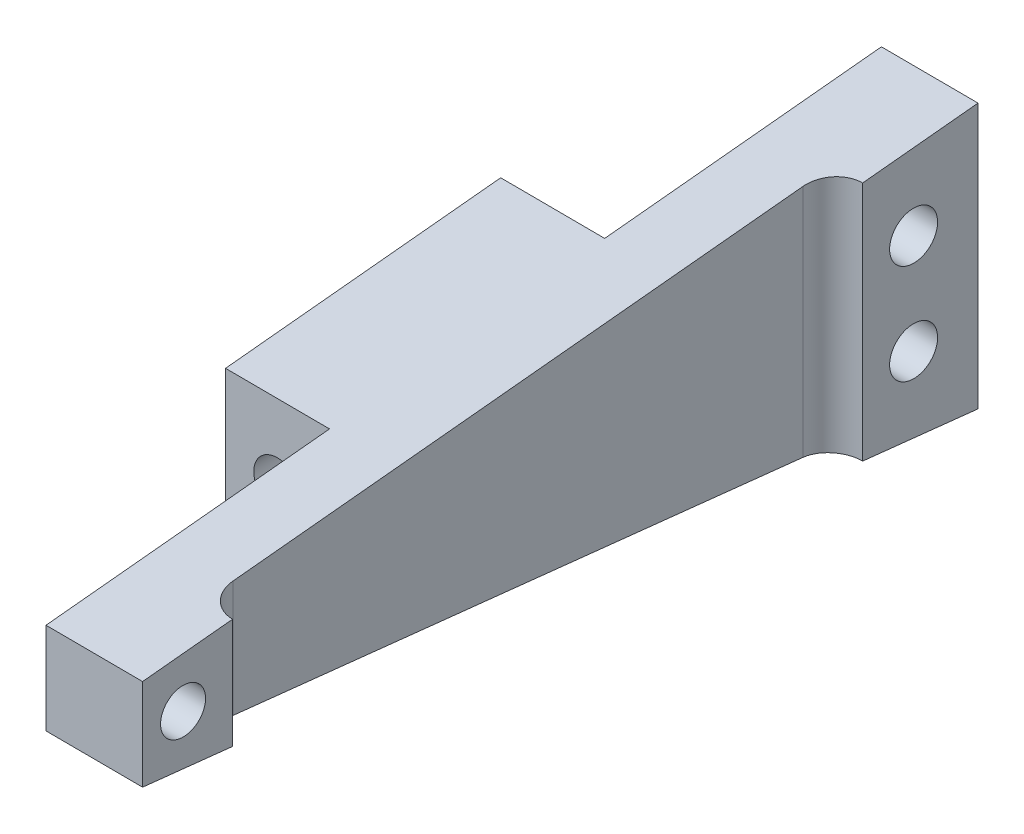
ISO-10303-21;
HEADER;
FILE_DESCRIPTION(('STEP AP214'),'2;1');
FILE_NAME('part.step','',(''),(''),'','','');
FILE_SCHEMA(('AUTOMOTIVE_DESIGN { 1 0 10303 214 1 1 1 1 }'));
ENDSEC;
DATA;
#1=APPLICATION_CONTEXT('core data for automotive mechanical design processes');
#2=APPLICATION_PROTOCOL_DEFINITION('international standard','automotive_design',2000,#1);
#3=PRODUCT_CONTEXT('',#1,'mechanical');
#4=PRODUCT('Part','Part','',(#3));
#5=PRODUCT_RELATED_PRODUCT_CATEGORY('part','',(#4));
#6=PRODUCT_DEFINITION_FORMATION('','',#4);
#7=PRODUCT_DEFINITION_CONTEXT('part definition',#1,'design');
#8=PRODUCT_DEFINITION('design','',#6,#7);
#9=PRODUCT_DEFINITION_SHAPE('','',#8);
#10=(LENGTH_UNIT() NAMED_UNIT(*) SI_UNIT(.MILLI.,.METRE.));
#11=(NAMED_UNIT(*) PLANE_ANGLE_UNIT() SI_UNIT($,.RADIAN.));
#12=(NAMED_UNIT(*) SI_UNIT($,.STERADIAN.) SOLID_ANGLE_UNIT());
#13=UNCERTAINTY_MEASURE_WITH_UNIT(LENGTH_MEASURE(1.E-05),#10,'distance_accuracy_value','');
#14=(GEOMETRIC_REPRESENTATION_CONTEXT(3) GLOBAL_UNCERTAINTY_ASSIGNED_CONTEXT((#13)) GLOBAL_UNIT_ASSIGNED_CONTEXT((#10,
#11,#12)) REPRESENTATION_CONTEXT('',''));
#15=CARTESIAN_POINT('',(0.,0.,0.));
#16=DIRECTION('',(0.,0.,1.));
#17=DIRECTION('',(1.,0.,0.));
#18=AXIS2_PLACEMENT_3D('',#15,#16,#17);
#19=CARTESIAN_POINT('',(130.825950697131,1.57325215210244,266.501896775733));
#20=DIRECTION('',(-0.999988650443594,0.,-0.00476434507561088));
#21=DIRECTION('',(0.,1.,0.));
#22=AXIS2_PLACEMENT_3D('',#19,#20,#21);
#23=PLANE('',#22);
#24=CARTESIAN_POINT('',(130.824521389846,1.56936987160643,266.801894160618));
#25=DIRECTION('',(0.999988650443594,0.,0.0047643450756115));
#26=DIRECTION('',(0.,-1.,0.));
#27=AXIS2_PLACEMENT_3D('',#24,#25,#26);
#28=CIRCLE('',#27,1.50000002235174);
#29=CARTESIAN_POINT('',(130.824521389846,3.06936989395742,266.801894160618));
#30=VERTEX_POINT('',#29);
#31=EDGE_CURVE('E27',#30,#30,#28,.T.);
#32=ORIENTED_EDGE('',*,*,#31,.F.);
#33=EDGE_LOOP('',(#32));
#34=FACE_BOUND('',#33,.T.);
#35=DIRECTION('',(0.00473836325241601,0.104293034034695,-0.994535324141645));
#36=VECTOR('',#35,1.);
#37=CARTESIAN_POINT('',(130.811657661905,4.63450482074439,269.501862727063));
#38=LINE('',#37,#36);
#39=CARTESIAN_POINT('',(130.811657661905,4.63450482074439,269.501862727063));
#40=VERTEX_POINT('',#39);
#41=CARTESIAN_POINT('',(130.840243732358,5.26369423909948,263.501930824402));
#42=VERTEX_POINT('',#41);
#43=EDGE_CURVE('E187',#40,#42,#38,.T.);
#44=ORIENTED_EDGE('',*,*,#43,.F.);
#45=DIRECTION('',(0.,-1.,0.));
#46=VECTOR('',#45,1.);
#47=CARTESIAN_POINT('',(130.811657661905,4.63450482074439,269.501862727063));
#48=LINE('',#47,#46);
#49=CARTESIAN_POINT('',(130.811657661905,-1.4957650775326,269.501862727063));
#50=VERTEX_POINT('',#49);
#51=EDGE_CURVE('E11',#40,#50,#48,.T.);
#52=ORIENTED_EDGE('',*,*,#51,.T.);
#53=DIRECTION('',(-0.00473899547985651,0.103019741551577,0.994668022393647));
#54=VECTOR('',#53,1.);
#55=CARTESIAN_POINT('',(131.076998466519,-7.26393709428799,213.809466625877));
#56=LINE('',#55,#54);
#57=CARTESIAN_POINT('',(130.840243732358,-2.11718993489554,263.501930824402));
#58=VERTEX_POINT('',#57);
#59=EDGE_CURVE('E216',#58,#50,#56,.T.);
#60=ORIENTED_EDGE('',*,*,#59,.F.);
#61=DIRECTION('',(0.,-1.,0.));
#62=VECTOR('',#61,1.);
#63=CARTESIAN_POINT('',(130.840243732358,5.26369423909948,263.501930824402));
#64=LINE('',#63,#62);
#65=EDGE_CURVE('E156',#42,#58,#64,.T.);
#66=ORIENTED_EDGE('',*,*,#65,.F.);
#67=EDGE_LOOP('',(#44,#52,#60,#66));
#68=FACE_BOUND('',#67,.T.);
#69=ADVANCED_FACE('F16',(#34,#68),#23,.F.);
#70=CARTESIAN_POINT('',(130.811657661905,-1.4957650775326,269.501862727063));
#71=DIRECTION('',(-0.004764345075611,0.,0.999988650443594));
#72=DIRECTION('',(0.,1.,0.));
#73=AXIS2_PLACEMENT_3D('',#70,#71,#72);
#74=PLANE('',#73);
#75=DIRECTION('',(-0.999988650443594,0.,-0.004764345075611));
#76=VECTOR('',#75,1.);
#77=CARTESIAN_POINT('',(130.811657661905,-1.4957650775326,269.501862727063));
#78=LINE('',#77,#76);
#79=CARTESIAN_POINT('',(124.311731434021,-1.49576507753264,269.470894484072));
#80=VERTEX_POINT('',#79);
#81=EDGE_CURVE('E220',#50,#80,#78,.T.);
#82=ORIENTED_EDGE('',*,*,#81,.F.);
#83=ORIENTED_EDGE('',*,*,#51,.F.);
#84=DIRECTION('',(-0.999988650443594,0.,-0.004764345075611));
#85=VECTOR('',#84,1.);
#86=CARTESIAN_POINT('',(127.311697385352,4.63450482074436,269.485187519299));
#87=LINE('',#86,#85);
#88=CARTESIAN_POINT('',(124.311731434021,4.63450482074435,269.470894484072));
#89=VERTEX_POINT('',#88);
#90=EDGE_CURVE('E186',#40,#89,#87,.T.);
#91=ORIENTED_EDGE('',*,*,#90,.T.);
#92=DIRECTION('',(0.,1.,0.));
#93=VECTOR('',#92,1.);
#94=CARTESIAN_POINT('',(124.311731434021,0.0548203934633562,269.470894484072));
#95=LINE('',#94,#93);
#96=EDGE_CURVE('E261',#80,#89,#95,.T.);
#97=ORIENTED_EDGE('',*,*,#96,.F.);
#98=EDGE_LOOP('',(#82,#83,#91,#97));
#99=FACE_BOUND('',#98,.T.);
#100=ADVANCED_FACE('F385',(#99),#74,.T.);
#101=CARTESIAN_POINT('',(130.824521389846,1.56936987160643,266.801894160618));
#102=DIRECTION('',(-0.999988650443594,0.,-0.004764345075611));
#103=DIRECTION('',(0.,-1.,0.));
#104=AXIS2_PLACEMENT_3D('',#101,#102,#103);
#105=CYLINDRICAL_SURFACE('',#104,1.50000002235174);
#106=CARTESIAN_POINT('',(124.324595161963,1.56936987160639,266.770925917626));
#107=DIRECTION('',(0.999988650443594,0.,0.00476434507561118));
#108=DIRECTION('',(0.,-1.,0.));
#109=AXIS2_PLACEMENT_3D('',#106,#107,#108);
#110=CIRCLE('',#109,1.50000002235174);
#111=CARTESIAN_POINT('',(124.324595161963,3.06936989395738,266.770925917626));
#112=VERTEX_POINT('',#111);
#113=EDGE_CURVE('E197',#112,#112,#110,.T.);
#114=ORIENTED_EDGE('',*,*,#113,.F.);
#115=DIRECTION('',(0.999988650443594,0.,0.004764345075611));
#116=VECTOR('',#115,1.);
#117=CARTESIAN_POINT('',(130.824521389846,3.06936989395742,266.801894160618));
#118=LINE('',#117,#116);
#119=EDGE_CURVE('E205',#112,#30,#118,.T.);
#120=ORIENTED_EDGE('',*,*,#119,.T.);
#121=ORIENTED_EDGE('',*,*,#31,.T.);
#122=ORIENTED_EDGE('',*,*,#119,.F.);
#123=EDGE_LOOP('',(#114,#120,#121,#122));
#124=FACE_BOUND('',#123,.T.);
#125=ADVANCED_FACE('F391',(#124),#105,.F.);
#126=CARTESIAN_POINT('',(131.058679028346,1.60540586445897,217.654534513304));
#127=DIRECTION('',(-0.999988650443594,0.,-0.00476434507561118));
#128=DIRECTION('',(0.00476434507561118,0.,-0.999988650443594));
#129=AXIS2_PLACEMENT_3D('',#126,#127,#128);
#130=PLANE('',#129);
#131=CARTESIAN_POINT('',(131.056544998353,-1.78063012839304,218.102446186298));
#132=DIRECTION('',(-0.999988650443594,0.,-0.00476434507561118));
#133=DIRECTION('',(0.,-1.,0.));
#134=AXIS2_PLACEMENT_3D('',#131,#132,#133);
#135=CIRCLE('',#134,1.6);
#136=CARTESIAN_POINT('',(131.056544998353,-0.180630128393033,218.102446186298));
#137=VERTEX_POINT('',#136);
#138=EDGE_CURVE('E254',#137,#137,#135,.T.);
#139=ORIENTED_EDGE('',*,*,#138,.T.);
#140=EDGE_LOOP('',(#139));
#141=FACE_BOUND('',#140,.T.);
#142=CARTESIAN_POINT('',(131.056544998353,4.91936987160697,218.102446186298));
#143=DIRECTION('',(-0.999988650443594,0.,-0.00476434507561118));
#144=DIRECTION('',(0.,-1.,0.));
#145=AXIS2_PLACEMENT_3D('',#142,#143,#144);
#146=CIRCLE('',#145,1.6);
#147=CARTESIAN_POINT('',(131.056544998353,6.51936987160696,218.102446186298));
#148=VERTEX_POINT('',#147);
#149=EDGE_CURVE('E269',#148,#148,#146,.T.);
#150=ORIENTED_EDGE('',*,*,#149,.T.);
#151=EDGE_LOOP('',(#150));
#152=FACE_BOUND('',#151,.T.);
#153=DIRECTION('',(0.,-1.,0.));
#154=VECTOR('',#153,1.);
#155=CARTESIAN_POINT('',(131.076998466519,10.474748823207,213.809466625877));
#156=LINE('',#155,#154);
#157=CARTESIAN_POINT('',(131.076998466519,10.474748823207,213.809466625877));
#158=VERTEX_POINT('',#157);
#159=CARTESIAN_POINT('',(131.076998466519,-7.26393709428799,213.809466625877));
#160=VERTEX_POINT('',#159);
#161=EDGE_CURVE('E137',#158,#160,#156,.T.);
#162=ORIENTED_EDGE('',*,*,#161,.F.);
#163=DIRECTION('',(0.00473836325241601,0.104293034034695,-0.994535324141645));
#164=VECTOR('',#163,1.);
#165=CARTESIAN_POINT('',(130.811657661905,4.63450482074439,269.501862727063));
#166=LINE('',#165,#164);
#167=CARTESIAN_POINT('',(131.040359590174,9.66831432799092,221.499602400732));
#168=VERTEX_POINT('',#167);
#169=EDGE_CURVE('E159',#168,#158,#166,.T.);
#170=ORIENTED_EDGE('',*,*,#169,.F.);
#171=DIRECTION('',(0.,-1.,0.));
#172=VECTOR('',#171,1.);
#173=CARTESIAN_POINT('',(131.040359590174,9.66831432799092,221.499602400732));
#174=LINE('',#173,#172);
#175=CARTESIAN_POINT('',(131.040359590174,-6.46745446673207,221.499602400732));
#176=VERTEX_POINT('',#175);
#177=EDGE_CURVE('E147',#168,#176,#174,.T.);
#178=ORIENTED_EDGE('',*,*,#177,.T.);
#179=DIRECTION('',(-0.00473899547985651,0.103019741551577,0.994668022393647));
#180=VECTOR('',#179,1.);
#181=CARTESIAN_POINT('',(131.076998466519,-7.26393709428799,213.809466625877));
#182=LINE('',#181,#180);
#183=EDGE_CURVE('E206',#160,#176,#182,.T.);
#184=ORIENTED_EDGE('',*,*,#183,.F.);
#185=EDGE_LOOP('',(#162,#170,#178,#184));
#186=FACE_BOUND('',#185,.T.);
#187=ADVANCED_FACE('F160',(#141,#152,#186),#130,.F.);
#188=CARTESIAN_POINT('',(130.849772422509,3.43206208486448,261.501953523515));
#189=DIRECTION('',(0.,1.,0.));
#190=DIRECTION('',(-0.710467656549133,0.,0.703729855127366));
#191=AXIS2_PLACEMENT_3D('',#188,#189,#190);
#192=CYLINDRICAL_SURFACE('',#191,2.);
#193=CARTESIAN_POINT('',(130.84977242251,-2.32433155401653,261.501953523515));
#194=DIRECTION('',(-0.000490821598348776,-0.994679311562599,0.103018572323209));
#195=DIRECTION('',(-0.00473899547989709,0.103019741551577,0.994668022393646));
#196=AXIS2_PLACEMENT_3D('',#193,#194,#195);
#197=ELLIPSE('',#196,2.01069829919161,2.);
#198=CARTESIAN_POINT('',(128.849795121622,-2.32433155401654,261.492424833363));
#199=VERTEX_POINT('',#198);
#200=EDGE_CURVE('E221',#58,#199,#197,.T.);
#201=ORIENTED_EDGE('',*,*,#200,.T.);
#202=DIRECTION('',(0.,1.,0.));
#203=VECTOR('',#202,1.);
#204=CARTESIAN_POINT('',(128.849795121622,3.43206208486446,261.492424833363));
#205=LINE('',#204,#203);
#206=CARTESIAN_POINT('',(128.849795121622,5.47342404521847,261.492424833363));
#207=VERTEX_POINT('',#206);
#208=EDGE_CURVE('E192',#199,#207,#205,.T.);
#209=ORIENTED_EDGE('',*,*,#208,.T.);
#210=CARTESIAN_POINT('',(130.849772422509,5.47342404521849,261.501953523515));
#211=DIRECTION('',(-0.000496888003126927,0.994546611804514,0.104291850355022));
#212=DIRECTION('',(-0.00473836325236151,-0.104293034034695,0.994535324141645));
#213=AXIS2_PLACEMENT_3D('',#210,#211,#212);
#214=ELLIPSE('',#213,2.01096658141661,2.);
#215=EDGE_CURVE('E191',#207,#42,#214,.T.);
#216=ORIENTED_EDGE('',*,*,#215,.T.);
#217=ORIENTED_EDGE('',*,*,#65,.T.);
#218=EDGE_LOOP('',(#201,#209,#216,#217));
#219=FACE_BOUND('',#218,.T.);
#220=ADVANCED_FACE('F316',(#219),#192,.F.);
#221=CARTESIAN_POINT('',(131.030830900023,-2.43351226805108,223.499579701619));
#222=DIRECTION('',(0.,-1.,0.));
#223=DIRECTION('',(-0.703729855127379,0.,-0.71046765654912));
#224=AXIS2_PLACEMENT_3D('',#221,#222,#223);
#225=CYLINDRICAL_SURFACE('',#224,2.);
#226=CARTESIAN_POINT('',(131.030830900023,9.4585845218729,223.499579701619));
#227=DIRECTION('',(-0.000496888003126927,0.994546611804514,0.104291850355022));
#228=DIRECTION('',(0.00473836325237559,0.104293034034695,-0.994535324141645));
#229=AXIS2_PLACEMENT_3D('',#226,#227,#228);
#230=ELLIPSE('',#229,2.01096658141661,2.);
#231=CARTESIAN_POINT('',(129.030853599136,9.45858452187288,223.490051011468));
#232=VERTEX_POINT('',#231);
#233=EDGE_CURVE('E151',#168,#232,#230,.T.);
#234=ORIENTED_EDGE('',*,*,#233,.T.);
#235=DIRECTION('',(0.,-1.,0.));
#236=VECTOR('',#235,1.);
#237=CARTESIAN_POINT('',(129.030853599136,-2.43351226805109,223.490051011468));
#238=LINE('',#237,#236);
#239=CARTESIAN_POINT('',(129.030853599136,-6.26031284761111,223.490051011468));
#240=VERTEX_POINT('',#239);
#241=EDGE_CURVE('E252',#232,#240,#238,.T.);
#242=ORIENTED_EDGE('',*,*,#241,.T.);
#243=CARTESIAN_POINT('',(131.030830900023,-6.2603128476111,223.499579701619));
#244=DIRECTION('',(-0.000490821598348776,-0.994679311562599,0.103018572323209));
#245=DIRECTION('',(0.00473899547989557,-0.103019741551577,-0.994668022393646));
#246=AXIS2_PLACEMENT_3D('',#243,#244,#245);
#247=ELLIPSE('',#246,2.01069829919161,2.);
#248=EDGE_CURVE('E153',#240,#176,#247,.T.);
#249=ORIENTED_EDGE('',*,*,#248,.T.);
#250=ORIENTED_EDGE('',*,*,#177,.F.);
#251=EDGE_LOOP('',(#234,#242,#249,#250));
#252=FACE_BOUND('',#251,.T.);
#253=ADVANCED_FACE('F148',(#252),#225,.F.);
#254=CARTESIAN_POINT('',(131.076998466519,10.474748823207,213.809466625877));
#255=DIRECTION('',(0.004764345075611,0.,-0.999988650443594));
#256=DIRECTION('',(0.999988650443594,0.,0.004764345075611));
#257=AXIS2_PLACEMENT_3D('',#254,#255,#256);
#258=PLANE('',#257);
#259=DIRECTION('',(-0.999988650443594,0.,-0.004764345075611));
#260=VECTOR('',#259,1.);
#261=CARTESIAN_POINT('',(127.577038189966,10.474748823207,213.792791418113));
#262=LINE('',#261,#260);
#263=CARTESIAN_POINT('',(124.577072238635,10.474748823207,213.778498382886));
#264=VERTEX_POINT('',#263);
#265=EDGE_CURVE('E164',#158,#264,#262,.T.);
#266=ORIENTED_EDGE('',*,*,#265,.F.);
#267=ORIENTED_EDGE('',*,*,#161,.T.);
#268=DIRECTION('',(-0.999988650443594,0.,-0.004764345075611));
#269=VECTOR('',#268,1.);
#270=CARTESIAN_POINT('',(131.076998466519,-7.26393709428799,213.809466625877));
#271=LINE('',#270,#269);
#272=CARTESIAN_POINT('',(124.577072238635,-7.26393709428803,213.778498382886));
#273=VERTEX_POINT('',#272);
#274=EDGE_CURVE('E209',#160,#273,#271,.T.);
#275=ORIENTED_EDGE('',*,*,#274,.T.);
#276=DIRECTION('',(0.,-1.,0.));
#277=VECTOR('',#276,1.);
#278=CARTESIAN_POINT('',(124.577072238635,6.04007734383297,213.778498382886));
#279=LINE('',#278,#277);
#280=EDGE_CURVE('E179',#264,#273,#279,.T.);
#281=ORIENTED_EDGE('',*,*,#280,.F.);
#282=EDGE_LOOP('',(#266,#267,#275,#281));
#283=FACE_BOUND('',#282,.T.);
#284=ADVANCED_FACE('F397',(#283),#258,.T.);
#285=CARTESIAN_POINT('',(130.840243732358,-2.11718993489554,263.501930824402));
#286=DIRECTION('',(-0.000490821598348776,-0.994679311562599,0.103018572323209));
#287=DIRECTION('',(-0.999988650443594,0.,-0.00476434507563739));
#288=AXIS2_PLACEMENT_3D('',#285,#286,#287);
#289=PLANE('',#288);
#290=DIRECTION('',(-0.00473899547985687,0.103019741551567,0.994668022393648));
#291=VECTOR('',#290,1.);
#292=CARTESIAN_POINT('',(117.57715168553,-7.26393709428808,213.745147967356));
#293=LINE('',#292,#291);
#294=CARTESIAN_POINT('',(117.489262724955,-5.35334274108028,232.192166745309));
#295=VERTEX_POINT('',#294);
#296=CARTESIAN_POINT('',(117.40186575886,-3.45344372286047,250.535920774764));
#297=VERTEX_POINT('',#296);
#298=EDGE_CURVE('E237',#295,#297,#293,.T.);
#299=ORIENTED_EDGE('',*,*,#298,.F.);
#300=DIRECTION('',(-0.999988650443594,0.,-0.004764345075611));
#301=VECTOR('',#300,1.);
#302=CARTESIAN_POINT('',(124.48918327806,-5.35334274108024,232.225517160838));
#303=LINE('',#302,#301);
#304=CARTESIAN_POINT('',(124.48918327806,-5.35334274108024,232.225517160838));
#305=VERTEX_POINT('',#304);
#306=EDGE_CURVE('E260',#305,#295,#303,.T.);
#307=ORIENTED_EDGE('',*,*,#306,.F.);
#308=DIRECTION('',(-0.00473899547985619,0.103019741551577,0.994668022393647));
#309=VECTOR('',#308,1.);
#310=CARTESIAN_POINT('',(124.447467313823,-4.44649067240932,240.981283193282));
#311=LINE('',#310,#309);
#312=EDGE_CURVE('E172',#273,#305,#311,.T.);
#313=ORIENTED_EDGE('',*,*,#312,.F.);
#314=ORIENTED_EDGE('',*,*,#274,.F.);
#315=ORIENTED_EDGE('',*,*,#183,.T.);
#316=ORIENTED_EDGE('',*,*,#248,.F.);
#317=DIRECTION('',(-0.00473899547985651,0.103019741551577,0.994668022393647));
#318=VECTOR('',#317,1.);
#319=CARTESIAN_POINT('',(128.98891487431,-5.3486182467402,232.292572276008));
#320=LINE('',#319,#318);
#321=EDGE_CURVE('E196',#240,#199,#320,.T.);
#322=ORIENTED_EDGE('',*,*,#321,.T.);
#323=ORIENTED_EDGE('',*,*,#200,.F.);
#324=ORIENTED_EDGE('',*,*,#59,.T.);
#325=ORIENTED_EDGE('',*,*,#81,.T.);
#326=DIRECTION('',(-0.00473899547985619,0.103019741551577,0.994668022393647));
#327=VECTOR('',#326,1.);
#328=CARTESIAN_POINT('',(124.447467313823,-4.44649067240932,240.981283193282));
#329=LINE('',#328,#327);
#330=CARTESIAN_POINT('',(124.401786311965,-3.45344372286042,250.569271190293));
#331=VERTEX_POINT('',#330);
#332=EDGE_CURVE('E265',#331,#80,#329,.T.);
#333=ORIENTED_EDGE('',*,*,#332,.F.);
#334=DIRECTION('',(-0.999988650443594,0.,-0.004764345075611));
#335=VECTOR('',#334,1.);
#336=CARTESIAN_POINT('',(127.651749425907,-3.45344372286041,250.584755311789));
#337=LINE('',#336,#335);
#338=EDGE_CURVE('E244',#331,#297,#337,.T.);
#339=ORIENTED_EDGE('',*,*,#338,.T.);
#340=EDGE_LOOP('',(#299,#307,#313,#314,#315,#316,#322,#323,#324,#325,#333,#339));
#341=FACE_BOUND('',#340,.T.);
#342=ADVANCED_FACE('F329',(#341),#289,.T.);
#343=CARTESIAN_POINT('',(130.811657661905,4.63450482074439,269.501862727063));
#344=DIRECTION('',(-0.000496888003126927,0.994546611804514,0.104291850355022));
#345=DIRECTION('',(0.999988650443594,0.,0.004764345075611));
#346=AXIS2_PLACEMENT_3D('',#343,#344,#345);
#347=PLANE('',#346);
#348=DIRECTION('',(0.00473836325241601,0.104293034034695,-0.994535324141645));
#349=VECTOR('',#348,1.);
#350=CARTESIAN_POINT('',(128.888846076203,6.33294922684356,253.296017824713));
#351=LINE('',#350,#349);
#352=EDGE_CURVE('E170',#207,#232,#351,.T.);
#353=ORIENTED_EDGE('',*,*,#352,.T.);
#354=ORIENTED_EDGE('',*,*,#233,.F.);
#355=ORIENTED_EDGE('',*,*,#169,.T.);
#356=ORIENTED_EDGE('',*,*,#265,.T.);
#357=DIRECTION('',(0.00473836325241601,0.104293034034695,-0.994535324141645));
#358=VECTOR('',#357,1.);
#359=CARTESIAN_POINT('',(124.433150229521,7.30697501708763,243.986296806199));
#360=LINE('',#359,#358);
#361=CARTESIAN_POINT('',(124.48918327806,8.54028203198577,232.225517160839));
#362=VERTEX_POINT('',#361);
#363=EDGE_CURVE('E201',#362,#264,#360,.T.);
#364=ORIENTED_EDGE('',*,*,#363,.F.);
#365=DIRECTION('',(-0.999988650443594,0.,-0.004764345075611));
#366=VECTOR('',#365,1.);
#367=CARTESIAN_POINT('',(124.48918327806,8.54028203198577,232.225517160839));
#368=LINE('',#367,#366);
#369=CARTESIAN_POINT('',(117.489262724955,8.54028203198573,232.192166745309));
#370=VERTEX_POINT('',#369);
#371=EDGE_CURVE('E238',#362,#370,#368,.T.);
#372=ORIENTED_EDGE('',*,*,#371,.T.);
#373=DIRECTION('',(0.00473836325241602,0.104293034034684,-0.994535324141646));
#374=VECTOR('',#373,1.);
#375=CARTESIAN_POINT('',(117.311810880916,4.6345048207443,269.437544068543));
#376=LINE('',#375,#374);
#377=CARTESIAN_POINT('',(117.40186575886,6.61664421151052,250.535920774764));
#378=VERTEX_POINT('',#377);
#379=EDGE_CURVE('E235',#378,#370,#376,.T.);
#380=ORIENTED_EDGE('',*,*,#379,.F.);
#381=DIRECTION('',(-0.999988650443594,0.,-0.004764345075611));
#382=VECTOR('',#381,1.);
#383=CARTESIAN_POINT('',(127.651749425907,6.61664421151058,250.584755311789));
#384=LINE('',#383,#382);
#385=CARTESIAN_POINT('',(124.401786311965,6.61664421151056,250.569271190293));
#386=VERTEX_POINT('',#385);
#387=EDGE_CURVE('E299',#386,#378,#384,.T.);
#388=ORIENTED_EDGE('',*,*,#387,.F.);
#389=DIRECTION('',(0.00473836325241601,0.104293034034695,-0.994535324141645));
#390=VECTOR('',#389,1.);
#391=CARTESIAN_POINT('',(124.433150229521,7.30697501708763,243.986296806199));
#392=LINE('',#391,#390);
#393=EDGE_CURVE('E202',#89,#386,#392,.T.);
#394=ORIENTED_EDGE('',*,*,#393,.F.);
#395=ORIENTED_EDGE('',*,*,#90,.F.);
#396=ORIENTED_EDGE('',*,*,#43,.T.);
#397=ORIENTED_EDGE('',*,*,#215,.F.);
#398=EDGE_LOOP('',(#353,#354,#355,#356,#364,#372,#380,#388,#394,#395,#396,#397));
#399=FACE_BOUND('',#398,.T.);
#400=ADVANCED_FACE('F167',(#399),#347,.T.);
#401=CARTESIAN_POINT('',(124.558752800463,1.60540586445893,217.623566270313));
#402=DIRECTION('',(-0.999988650443594,0.,-0.00476434507561118));
#403=DIRECTION('',(0.00476434507561118,0.,-0.999988650443594));
#404=AXIS2_PLACEMENT_3D('',#401,#402,#403);
#405=PLANE('',#404);
#406=CARTESIAN_POINT('',(124.556618770469,-1.78063012839308,218.071477943306));
#407=DIRECTION('',(0.999988650443594,0.,0.00476434507561118));
#408=DIRECTION('',(0.,-1.,0.));
#409=AXIS2_PLACEMENT_3D('',#406,#407,#408);
#410=CIRCLE('',#409,3.);
#411=CARTESIAN_POINT('',(124.556618770469,1.21936987160692,218.071477943306));
#412=VERTEX_POINT('',#411);
#413=EDGE_CURVE('E229',#412,#412,#410,.T.);
#414=ORIENTED_EDGE('',*,*,#413,.T.);
#415=EDGE_LOOP('',(#414));
#416=FACE_BOUND('',#415,.T.);
#417=CARTESIAN_POINT('',(124.556618770469,4.91936987160693,218.071477943306));
#418=DIRECTION('',(0.999988650443594,0.,0.00476434507561118));
#419=DIRECTION('',(0.,-1.,0.));
#420=AXIS2_PLACEMENT_3D('',#417,#418,#419);
#421=CIRCLE('',#420,3.);
#422=CARTESIAN_POINT('',(124.556618770469,7.91936987160692,218.071477943306));
#423=VERTEX_POINT('',#422);
#424=EDGE_CURVE('E285',#423,#423,#421,.T.);
#425=ORIENTED_EDGE('',*,*,#424,.T.);
#426=EDGE_LOOP('',(#425));
#427=FACE_BOUND('',#426,.T.);
#428=DIRECTION('',(0.,1.,0.));
#429=VECTOR('',#428,1.);
#430=CARTESIAN_POINT('',(124.48918327806,5.07284394822277,232.225517160839));
#431=LINE('',#430,#429);
#432=EDGE_CURVE('E225',#305,#362,#431,.T.);
#433=ORIENTED_EDGE('',*,*,#432,.T.);
#434=ORIENTED_EDGE('',*,*,#363,.T.);
#435=ORIENTED_EDGE('',*,*,#280,.T.);
#436=ORIENTED_EDGE('',*,*,#312,.T.);
#437=EDGE_LOOP('',(#433,#434,#435,#436));
#438=FACE_BOUND('',#437,.T.);
#439=ADVANCED_FACE('F401',(#416,#427,#438),#405,.T.);
#440=CARTESIAN_POINT('',(124.558752800463,1.60540586445893,217.623566270313));
#441=DIRECTION('',(-0.999988650443594,0.,-0.00476434507561118));
#442=DIRECTION('',(0.00476434507561118,0.,-0.999988650443594));
#443=AXIS2_PLACEMENT_3D('',#440,#441,#442);
#444=PLANE('',#443);
#445=ORIENTED_EDGE('',*,*,#113,.T.);
#446=EDGE_LOOP('',(#445));
#447=FACE_BOUND('',#446,.T.);
#448=DIRECTION('',(0.,-1.,0.));
#449=VECTOR('',#448,1.);
#450=CARTESIAN_POINT('',(124.401786311965,-0.820448119640438,250.569271190293));
#451=LINE('',#450,#449);
#452=EDGE_CURVE('E295',#386,#331,#451,.T.);
#453=ORIENTED_EDGE('',*,*,#452,.T.);
#454=ORIENTED_EDGE('',*,*,#332,.T.);
#455=ORIENTED_EDGE('',*,*,#96,.T.);
#456=ORIENTED_EDGE('',*,*,#393,.T.);
#457=EDGE_LOOP('',(#453,#454,#455,#456));
#458=FACE_BOUND('',#457,.T.);
#459=ADVANCED_FACE('F404',(#447,#458),#444,.T.);
#460=CARTESIAN_POINT('',(117.440799896832,1.56936987160562,242.36403241048));
#461=DIRECTION('',(-0.999988650443594,0.,-0.00476434507561118));
#462=DIRECTION('',(0.00476434507561118,0.,-0.999988650443594));
#463=AXIS2_PLACEMENT_3D('',#460,#461,#462);
#464=PLANE('',#463);
#465=ORIENTED_EDGE('',*,*,#379,.T.);
#466=DIRECTION('',(0.,-1.,0.));
#467=VECTOR('',#466,1.);
#468=CARTESIAN_POINT('',(117.489262724955,8.54028203198573,232.192166745309));
#469=LINE('',#468,#467);
#470=EDGE_CURVE('E256',#370,#295,#469,.T.);
#471=ORIENTED_EDGE('',*,*,#470,.T.);
#472=ORIENTED_EDGE('',*,*,#298,.T.);
#473=DIRECTION('',(0.,1.,0.));
#474=VECTOR('',#473,1.);
#475=CARTESIAN_POINT('',(117.40186575886,-0.838466116067471,250.535920774764));
#476=LINE('',#475,#474);
#477=EDGE_CURVE('E248',#297,#378,#476,.T.);
#478=ORIENTED_EDGE('',*,*,#477,.T.);
#479=EDGE_LOOP('',(#465,#471,#472,#478));
#480=FACE_BOUND('',#479,.T.);
#481=ADVANCED_FACE('F416',(#480),#464,.T.);
#482=CARTESIAN_POINT('',(124.48918327806,8.54028203198577,232.225517160839));
#483=DIRECTION('',(0.004764345075611,0.,-0.999988650443594));
#484=DIRECTION('',(0.,1.,0.));
#485=AXIS2_PLACEMENT_3D('',#482,#483,#484);
#486=PLANE('',#485);
#487=CARTESIAN_POINT('',(120.989223001508,1.58030615082674,232.208841953074));
#488=DIRECTION('',(-0.00476434507560551,0.,0.999988650443594));
#489=DIRECTION('',(0.999988650443594,0.,0.00476434507560551));
#490=AXIS2_PLACEMENT_3D('',#487,#488,#489);
#491=CIRCLE('',#490,1.6);
#492=CARTESIAN_POINT('',(119.389241160798,1.58030615082674,232.201219000953));
#493=VERTEX_POINT('',#492);
#494=EDGE_CURVE('E213',#493,#493,#491,.T.);
#495=ORIENTED_EDGE('',*,*,#494,.T.);
#496=EDGE_LOOP('',(#495));
#497=FACE_BOUND('',#496,.T.);
#498=ORIENTED_EDGE('',*,*,#432,.F.);
#499=ORIENTED_EDGE('',*,*,#306,.T.);
#500=ORIENTED_EDGE('',*,*,#470,.F.);
#501=ORIENTED_EDGE('',*,*,#371,.F.);
#502=EDGE_LOOP('',(#498,#499,#500,#501));
#503=FACE_BOUND('',#502,.T.);
#504=ADVANCED_FACE('F18',(#497,#503),#486,.T.);
#505=CARTESIAN_POINT('',(120.892297345261,1.58030615082652,252.552573283416));
#506=DIRECTION('',(0.00476434507560551,0.,-0.999988650443594));
#507=DIRECTION('',(0.999988650443594,0.,0.00476434507560551));
#508=AXIS2_PLACEMENT_3D('',#505,#506,#507);
#509=CYLINDRICAL_SURFACE('',#508,1.6);
#510=CARTESIAN_POINT('',(120.901826035412,1.58030615082654,250.552595982529));
#511=DIRECTION('',(-0.00476434507560551,0.,0.999988650443594));
#512=DIRECTION('',(0.999988650443594,0.,0.00476434507560551));
#513=AXIS2_PLACEMENT_3D('',#510,#511,#512);
#514=CIRCLE('',#513,1.6);
#515=CARTESIAN_POINT('',(119.301844194703,1.58030615082654,250.544973030408));
#516=VERTEX_POINT('',#515);
#517=EDGE_CURVE('E214',#516,#516,#514,.T.);
#518=ORIENTED_EDGE('',*,*,#517,.T.);
#519=DIRECTION('',(0.00476434507560551,0.,-0.999988650443594));
#520=VECTOR('',#519,1.);
#521=CARTESIAN_POINT('',(119.292315504551,1.58030615082652,252.544950331295));
#522=LINE('',#521,#520);
#523=EDGE_CURVE('E210',#516,#493,#522,.T.);
#524=ORIENTED_EDGE('',*,*,#523,.T.);
#525=ORIENTED_EDGE('',*,*,#494,.F.);
#526=ORIENTED_EDGE('',*,*,#523,.F.);
#527=EDGE_LOOP('',(#518,#524,#525,#526));
#528=FACE_BOUND('',#527,.T.);
#529=ADVANCED_FACE('F409',(#528),#509,.F.);
#530=CARTESIAN_POINT('',(120.901826035412,1.58030615082654,250.552595982529));
#531=DIRECTION('',(-0.00476434507560565,0.,0.999988650443594));
#532=DIRECTION('',(-0.999988650443594,0.,-0.00476434507560565));
#533=AXIS2_PLACEMENT_3D('',#530,#531,#532);
#534=PLANE('',#533);
#535=ORIENTED_EDGE('',*,*,#517,.F.);
#536=EDGE_LOOP('',(#535));
#537=FACE_BOUND('',#536,.T.);
#538=ORIENTED_EDGE('',*,*,#452,.F.);
#539=ORIENTED_EDGE('',*,*,#387,.T.);
#540=ORIENTED_EDGE('',*,*,#477,.F.);
#541=ORIENTED_EDGE('',*,*,#338,.F.);
#542=EDGE_LOOP('',(#538,#539,#540,#541));
#543=FACE_BOUND('',#542,.T.);
#544=ADVANCED_FACE('F406',(#537,#543),#534,.T.);
#545=CARTESIAN_POINT('',(128.940324360379,1.60042993062968,242.491237922416));
#546=DIRECTION('',(-0.999988650443594,0.,-0.00476434507561134));
#547=DIRECTION('',(0.,-1.,0.));
#548=AXIS2_PLACEMENT_3D('',#545,#546,#547);
#549=PLANE('',#548);
#550=ORIENTED_EDGE('',*,*,#352,.F.);
#551=ORIENTED_EDGE('',*,*,#208,.F.);
#552=ORIENTED_EDGE('',*,*,#321,.F.);
#553=ORIENTED_EDGE('',*,*,#241,.F.);
#554=EDGE_LOOP('',(#550,#551,#552,#553));
#555=FACE_BOUND('',#554,.T.);
#556=ADVANCED_FACE('F408',(#555),#549,.F.);
#557=CARTESIAN_POINT('',(124.556618770469,-1.78063012839308,218.071477943306));
#558=DIRECTION('',(0.999988650443594,0.,0.004764345075611));
#559=DIRECTION('',(0.,-1.,0.));
#560=AXIS2_PLACEMENT_3D('',#557,#558,#559);
#561=CYLINDRICAL_SURFACE('',#560,1.6);
#562=CARTESIAN_POINT('',(126.556596071356,-1.78063012839307,218.081006633457));
#563=DIRECTION('',(-0.999988650443594,0.,-0.00476434507561118));
#564=DIRECTION('',(0.,-1.,0.));
#565=AXIS2_PLACEMENT_3D('',#562,#563,#564);
#566=CIRCLE('',#565,1.6);
#567=CARTESIAN_POINT('',(126.556596071356,-0.180630128393061,218.081006633457));
#568=VERTEX_POINT('',#567);
#569=EDGE_CURVE('E183',#568,#568,#566,.T.);
#570=ORIENTED_EDGE('',*,*,#569,.T.);
#571=DIRECTION('',(0.999988650443594,0.,0.004764345075611));
#572=VECTOR('',#571,1.);
#573=CARTESIAN_POINT('',(124.556618770469,-0.180630128393075,218.071477943306));
#574=LINE('',#573,#572);
#575=EDGE_CURVE('E20',#568,#137,#574,.T.);
#576=ORIENTED_EDGE('',*,*,#575,.T.);
#577=ORIENTED_EDGE('',*,*,#138,.F.);
#578=ORIENTED_EDGE('',*,*,#575,.F.);
#579=EDGE_LOOP('',(#570,#576,#577,#578));
#580=FACE_BOUND('',#579,.T.);
#581=ADVANCED_FACE('F378',(#580),#561,.F.);
#582=CARTESIAN_POINT('',(124.556618770469,4.91936987160693,218.071477943306));
#583=DIRECTION('',(0.999988650443594,0.,0.004764345075611));
#584=DIRECTION('',(0.,-1.,0.));
#585=AXIS2_PLACEMENT_3D('',#582,#583,#584);
#586=CYLINDRICAL_SURFACE('',#585,1.6);
#587=CARTESIAN_POINT('',(126.556596071356,4.91936987160695,218.081006633457));
#588=DIRECTION('',(-0.999988650443594,0.,-0.00476434507561118));
#589=DIRECTION('',(0.,-1.,0.));
#590=AXIS2_PLACEMENT_3D('',#587,#588,#589);
#591=CIRCLE('',#590,1.6);
#592=CARTESIAN_POINT('',(126.556596071356,6.51936987160694,218.081006633457));
#593=VERTEX_POINT('',#592);
#594=EDGE_CURVE('E234',#593,#593,#591,.T.);
#595=ORIENTED_EDGE('',*,*,#594,.T.);
#596=DIRECTION('',(0.999988650443594,0.,0.004764345075611));
#597=VECTOR('',#596,1.);
#598=CARTESIAN_POINT('',(124.556618770469,6.51936987160692,218.071477943306));
#599=LINE('',#598,#597);
#600=EDGE_CURVE('E272',#593,#148,#599,.T.);
#601=ORIENTED_EDGE('',*,*,#600,.T.);
#602=ORIENTED_EDGE('',*,*,#149,.F.);
#603=ORIENTED_EDGE('',*,*,#600,.F.);
#604=EDGE_LOOP('',(#595,#601,#602,#603));
#605=FACE_BOUND('',#604,.T.);
#606=ADVANCED_FACE('F368',(#605),#586,.F.);
#607=CARTESIAN_POINT('',(126.556596071356,-1.78063012839307,218.081006633457));
#608=DIRECTION('',(-0.999988650443594,0.,-0.00476434507561118));
#609=DIRECTION('',(0.00476434507561118,0.,-0.999988650443594));
#610=AXIS2_PLACEMENT_3D('',#607,#608,#609);
#611=PLANE('',#610);
#612=ORIENTED_EDGE('',*,*,#569,.F.);
#613=EDGE_LOOP('',(#612));
#614=FACE_BOUND('',#613,.T.);
#615=CARTESIAN_POINT('',(126.556596071356,-1.78063012839307,218.081006633457));
#616=DIRECTION('',(0.999988650443594,0.,0.00476434507561118));
#617=DIRECTION('',(0.,-1.,0.));
#618=AXIS2_PLACEMENT_3D('',#615,#616,#617);
#619=CIRCLE('',#618,3.);
#620=CARTESIAN_POINT('',(126.556596071356,1.21936987160694,218.081006633457));
#621=VERTEX_POINT('',#620);
#622=EDGE_CURVE('E279',#621,#621,#619,.T.);
#623=ORIENTED_EDGE('',*,*,#622,.F.);
#624=EDGE_LOOP('',(#623));
#625=FACE_BOUND('',#624,.T.);
#626=ADVANCED_FACE('F366',(#614,#625),#611,.T.);
#627=CARTESIAN_POINT('',(124.556618770469,-1.78063012839308,218.071477943306));
#628=DIRECTION('',(0.999988650443594,0.,0.004764345075611));
#629=DIRECTION('',(0.,-1.,0.));
#630=AXIS2_PLACEMENT_3D('',#627,#628,#629);
#631=CYLINDRICAL_SURFACE('',#630,3.);
#632=ORIENTED_EDGE('',*,*,#413,.F.);
#633=DIRECTION('',(0.999988650443594,0.,0.004764345075611));
#634=VECTOR('',#633,1.);
#635=CARTESIAN_POINT('',(124.556618770469,1.21936987160692,218.071477943306));
#636=LINE('',#635,#634);
#637=EDGE_CURVE('E233',#412,#621,#636,.T.);
#638=ORIENTED_EDGE('',*,*,#637,.T.);
#639=ORIENTED_EDGE('',*,*,#622,.T.);
#640=ORIENTED_EDGE('',*,*,#637,.F.);
#641=EDGE_LOOP('',(#632,#638,#639,#640));
#642=FACE_BOUND('',#641,.T.);
#643=ADVANCED_FACE('F364',(#642),#631,.F.);
#644=CARTESIAN_POINT('',(126.556596071356,4.91936987160695,218.081006633457));
#645=DIRECTION('',(-0.999988650443594,0.,-0.00476434507561118));
#646=DIRECTION('',(0.00476434507561118,0.,-0.999988650443594));
#647=AXIS2_PLACEMENT_3D('',#644,#645,#646);
#648=PLANE('',#647);
#649=ORIENTED_EDGE('',*,*,#594,.F.);
#650=EDGE_LOOP('',(#649));
#651=FACE_BOUND('',#650,.T.);
#652=CARTESIAN_POINT('',(126.556596071356,4.91936987160695,218.081006633457));
#653=DIRECTION('',(0.999988650443594,0.,0.00476434507561118));
#654=DIRECTION('',(0.,-1.,0.));
#655=AXIS2_PLACEMENT_3D('',#652,#653,#654);
#656=CIRCLE('',#655,3.);
#657=CARTESIAN_POINT('',(126.556596071356,7.91936987160693,218.081006633457));
#658=VERTEX_POINT('',#657);
#659=EDGE_CURVE('E284',#658,#658,#656,.T.);
#660=ORIENTED_EDGE('',*,*,#659,.F.);
#661=EDGE_LOOP('',(#660));
#662=FACE_BOUND('',#661,.T.);
#663=ADVANCED_FACE('F376',(#651,#662),#648,.T.);
#664=CARTESIAN_POINT('',(124.556618770469,4.91936987160693,218.071477943306));
#665=DIRECTION('',(0.999988650443594,0.,0.004764345075611));
#666=DIRECTION('',(0.,-1.,0.));
#667=AXIS2_PLACEMENT_3D('',#664,#665,#666);
#668=CYLINDRICAL_SURFACE('',#667,3.);
#669=ORIENTED_EDGE('',*,*,#424,.F.);
#670=DIRECTION('',(0.999988650443594,0.,0.004764345075611));
#671=VECTOR('',#670,1.);
#672=CARTESIAN_POINT('',(124.556618770469,7.91936987160692,218.071477943306));
#673=LINE('',#672,#671);
#674=EDGE_CURVE('E280',#423,#658,#673,.T.);
#675=ORIENTED_EDGE('',*,*,#674,.T.);
#676=ORIENTED_EDGE('',*,*,#659,.T.);
#677=ORIENTED_EDGE('',*,*,#674,.F.);
#678=EDGE_LOOP('',(#669,#675,#676,#677));
#679=FACE_BOUND('',#678,.T.);
#680=ADVANCED_FACE('F478',(#679),#668,.F.);
#681=CLOSED_SHELL('',(#69,#100,#125,#187,#220,#253,#284,#342,#400,#439,#459,#481,#504,#529,#544,
#556,#581,#606,#626,#643,#663,#680));
#682=MANIFOLD_SOLID_BREP('B1',#681);
#683=ADVANCED_BREP_SHAPE_REPRESENTATION('',(#18,#682),#14);
#684=SHAPE_DEFINITION_REPRESENTATION(#9,#683);
ENDSEC;
END-ISO-10303-21;
